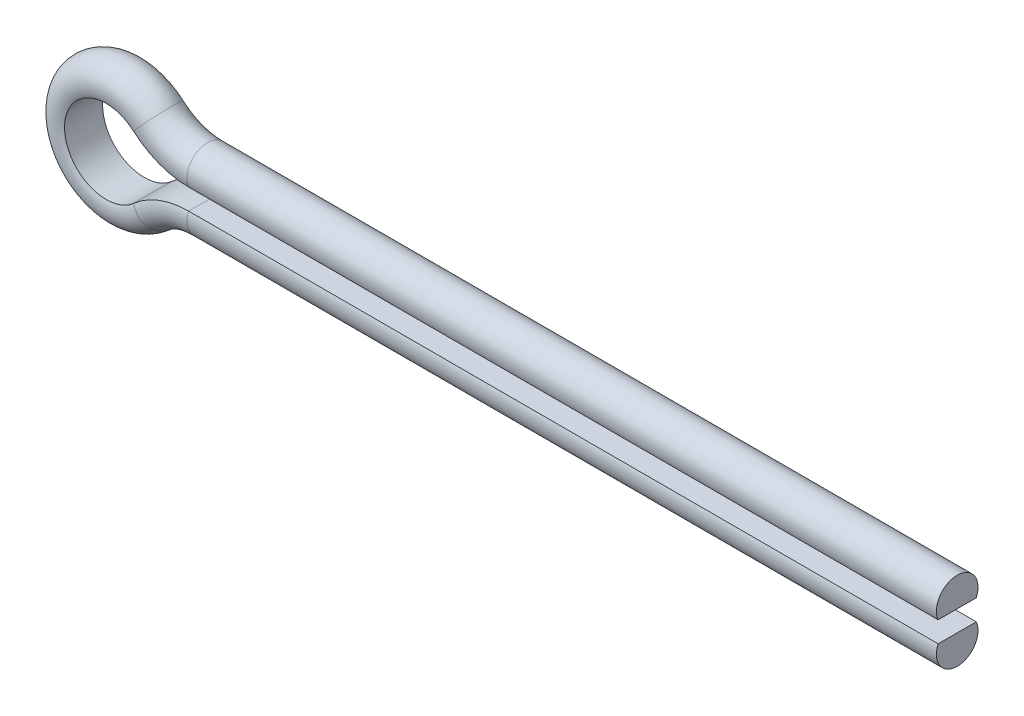
ISO-10303-21;
HEADER;
FILE_DESCRIPTION(('STEP AP214'),'2;1');
FILE_NAME('part.step','',(''),(''),'','','');
FILE_SCHEMA(('AUTOMOTIVE_DESIGN { 1 0 10303 214 1 1 1 1 }'));
ENDSEC;
DATA;
#1=APPLICATION_CONTEXT('core data for automotive mechanical design processes');
#2=APPLICATION_PROTOCOL_DEFINITION('international standard','automotive_design',2000,#1);
#3=PRODUCT_CONTEXT('',#1,'mechanical');
#4=PRODUCT('Part','Part','',(#3));
#5=PRODUCT_RELATED_PRODUCT_CATEGORY('part','',(#4));
#6=PRODUCT_DEFINITION_FORMATION('','',#4);
#7=PRODUCT_DEFINITION_CONTEXT('part definition',#1,'design');
#8=PRODUCT_DEFINITION('design','',#6,#7);
#9=PRODUCT_DEFINITION_SHAPE('','',#8);
#10=(LENGTH_UNIT() NAMED_UNIT(*) SI_UNIT(.MILLI.,.METRE.));
#11=(NAMED_UNIT(*) PLANE_ANGLE_UNIT() SI_UNIT($,.RADIAN.));
#12=(NAMED_UNIT(*) SI_UNIT($,.STERADIAN.) SOLID_ANGLE_UNIT());
#13=UNCERTAINTY_MEASURE_WITH_UNIT(LENGTH_MEASURE(1.E-05),#10,'distance_accuracy_value','');
#14=(GEOMETRIC_REPRESENTATION_CONTEXT(3) GLOBAL_UNCERTAINTY_ASSIGNED_CONTEXT((#13)) GLOBAL_UNIT_ASSIGNED_CONTEXT((#10,
#11,#12)) REPRESENTATION_CONTEXT('',''));
#15=CARTESIAN_POINT('',(0.,0.,0.));
#16=DIRECTION('',(0.,0.,1.));
#17=DIRECTION('',(1.,0.,0.));
#18=AXIS2_PLACEMENT_3D('',#15,#16,#17);
#19=CARTESIAN_POINT('',(9.92156741649231,-1.24999999999998,2.29128784747792));
#20=DIRECTION('',(0.,1.,0.));
#21=DIRECTION('',(0.,0.,1.));
#22=AXIS2_PLACEMENT_3D('',#19,#20,#21);
#23=PLANE('',#22);
#24=DIRECTION('',(0.,0.,1.));
#25=VECTOR('',#24,1.);
#26=CARTESIAN_POINT('',(9.92156741649231,-1.24999999999998,2.29128784747792));
#27=LINE('',#26,#25);
#28=CARTESIAN_POINT('',(9.92156741649231,-1.24999999999998,-2.29128784747792));
#29=VERTEX_POINT('',#28);
#30=CARTESIAN_POINT('',(9.92156741649231,-1.24999999999998,2.29128784747792));
#31=VERTEX_POINT('',#30);
#32=EDGE_CURVE('E139',#29,#31,#27,.T.);
#33=ORIENTED_EDGE('',*,*,#32,.T.);
#34=DIRECTION('',(1.,0.,0.));
#35=VECTOR('',#34,1.);
#36=CARTESIAN_POINT('',(9.92156741649231,-1.24999999999998,2.29128784747792));
#37=LINE('',#36,#35);
#38=CARTESIAN_POINT('',(100.,-1.24999999999999,2.29128784747792));
#39=VERTEX_POINT('',#38);
#40=EDGE_CURVE('E39',#31,#39,#37,.T.);
#41=ORIENTED_EDGE('',*,*,#40,.T.);
#42=DIRECTION('',(0.,0.,1.));
#43=VECTOR('',#42,1.);
#44=CARTESIAN_POINT('',(100.,-1.24999999999999,2.29128784747792));
#45=LINE('',#44,#43);
#46=CARTESIAN_POINT('',(100.,-1.24999999999999,-2.29128784747792));
#47=VERTEX_POINT('',#46);
#48=EDGE_CURVE('E46',#47,#39,#45,.T.);
#49=ORIENTED_EDGE('',*,*,#48,.F.);
#50=DIRECTION('',(1.,0.,0.));
#51=VECTOR('',#50,1.);
#52=CARTESIAN_POINT('',(9.92156741649231,-1.24999999999998,-2.29128784747792));
#53=LINE('',#52,#51);
#54=EDGE_CURVE('E11',#29,#47,#53,.T.);
#55=ORIENTED_EDGE('',*,*,#54,.F.);
#56=EDGE_LOOP('',(#33,#41,#49,#55));
#57=FACE_BOUND('',#56,.T.);
#58=ADVANCED_FACE('F32',(#57),#23,.T.);
#59=CARTESIAN_POINT('',(9.92156741649232,-2.24999999999998,0.));
#60=DIRECTION('',(1.,0.,0.));
#61=DIRECTION('',(0.,1.,0.));
#62=AXIS2_PLACEMENT_3D('',#59,#60,#61);
#63=CYLINDRICAL_SURFACE('',#62,2.5);
#64=CARTESIAN_POINT('',(9.92156741649232,-2.24999999999998,0.));
#65=DIRECTION('',(1.,0.,0.));
#66=DIRECTION('',(0.,1.,0.));
#67=AXIS2_PLACEMENT_3D('',#64,#65,#66);
#68=CIRCLE('',#67,2.5);
#69=EDGE_CURVE('E136',#31,#29,#68,.T.);
#70=ORIENTED_EDGE('',*,*,#69,.T.);
#71=ORIENTED_EDGE('',*,*,#54,.T.);
#72=CARTESIAN_POINT('',(100.,-2.24999999999999,0.));
#73=DIRECTION('',(1.,0.,0.));
#74=DIRECTION('',(0.,1.,0.));
#75=AXIS2_PLACEMENT_3D('',#72,#73,#74);
#76=CIRCLE('',#75,2.5);
#77=EDGE_CURVE('E52',#39,#47,#76,.T.);
#78=ORIENTED_EDGE('',*,*,#77,.F.);
#79=ORIENTED_EDGE('',*,*,#40,.F.);
#80=EDGE_LOOP('',(#70,#71,#78,#79));
#81=FACE_BOUND('',#80,.T.);
#82=ADVANCED_FACE('F151',(#81),#63,.T.);
#83=CARTESIAN_POINT('',(9.92156741649223,-11.25,0.));
#84=DIRECTION('',(0.,0.,-1.));
#85=DIRECTION('',(-1.,0.,0.));
#86=AXIS2_PLACEMENT_3D('',#83,#84,#85);
#87=CYLINDRICAL_SURFACE('',#86,10.);
#88=DIRECTION('',(0.,0.,1.));
#89=VECTOR('',#88,1.);
#90=CARTESIAN_POINT('',(3.30718913883079,-3.74999999999995,2.29128784747792));
#91=LINE('',#90,#89);
#92=CARTESIAN_POINT('',(3.30718913883079,-3.74999999999995,-2.29128784747792));
#93=VERTEX_POINT('',#92);
#94=CARTESIAN_POINT('',(3.30718913883079,-3.74999999999995,2.29128784747792));
#95=VERTEX_POINT('',#94);
#96=EDGE_CURVE('E127',#93,#95,#91,.T.);
#97=ORIENTED_EDGE('',*,*,#96,.T.);
#98=CARTESIAN_POINT('',(9.92156741649223,-11.25,2.29128784747792));
#99=DIRECTION('',(0.,0.,-1.));
#100=DIRECTION('',(-1.,0.,0.));
#101=AXIS2_PLACEMENT_3D('',#98,#99,#100);
#102=CIRCLE('',#101,10.);
#103=EDGE_CURVE('E142',#95,#31,#102,.T.);
#104=ORIENTED_EDGE('',*,*,#103,.T.);
#105=ORIENTED_EDGE('',*,*,#32,.F.);
#106=CARTESIAN_POINT('',(9.92156741649223,-11.25,-2.29128784747792));
#107=DIRECTION('',(0.,0.,-1.));
#108=DIRECTION('',(-1.,0.,0.));
#109=AXIS2_PLACEMENT_3D('',#106,#107,#108);
#110=CIRCLE('',#109,10.);
#111=EDGE_CURVE('E145',#93,#29,#110,.T.);
#112=ORIENTED_EDGE('',*,*,#111,.F.);
#113=EDGE_LOOP('',(#97,#104,#105,#112));
#114=FACE_BOUND('',#113,.T.);
#115=ADVANCED_FACE('F154',(#114),#87,.T.);
#116=CARTESIAN_POINT('',(9.92156741649223,-11.25,0.));
#117=DIRECTION('',(0.,0.,-1.));
#118=DIRECTION('',(-1.,0.,0.));
#119=AXIS2_PLACEMENT_3D('',#116,#117,#118);
#120=TOROIDAL_SURFACE('',#119,9.00000000000001,2.5);
#121=CARTESIAN_POINT('',(3.96862696659695,-4.49999999999993,0.));
#122=DIRECTION('',(0.749999999999988,0.661437827766161,0.));
#123=DIRECTION('',(-0.661437827766161,0.749999999999988,0.));
#124=AXIS2_PLACEMENT_3D('',#121,#122,#123);
#125=CIRCLE('',#124,2.5);
#126=EDGE_CURVE('E95',#95,#93,#125,.T.);
#127=ORIENTED_EDGE('',*,*,#126,.T.);
#128=ORIENTED_EDGE('',*,*,#111,.T.);
#129=ORIENTED_EDGE('',*,*,#69,.F.);
#130=ORIENTED_EDGE('',*,*,#103,.F.);
#131=EDGE_LOOP('',(#127,#128,#129,#130));
#132=FACE_BOUND('',#131,.T.);
#133=ADVANCED_FACE('F155',(#132),#120,.T.);
#134=CARTESIAN_POINT('',(0.,0.,0.));
#135=DIRECTION('',(0.,0.,1.));
#136=DIRECTION('',(1.,0.,0.));
#137=AXIS2_PLACEMENT_3D('',#134,#135,#136);
#138=CYLINDRICAL_SURFACE('',#137,5.);
#139=DIRECTION('',(0.,0.,1.));
#140=VECTOR('',#139,1.);
#141=CARTESIAN_POINT('',(3.30718913883075,3.75,2.29128784747792));
#142=LINE('',#141,#140);
#143=CARTESIAN_POINT('',(3.30718913883075,3.74999999999999,-2.29128784747792));
#144=VERTEX_POINT('',#143);
#145=CARTESIAN_POINT('',(3.30718913883075,3.75,2.29128784747792));
#146=VERTEX_POINT('',#145);
#147=EDGE_CURVE('E92',#144,#146,#142,.T.);
#148=ORIENTED_EDGE('',*,*,#147,.T.);
#149=CARTESIAN_POINT('',(0.,0.,2.29128784747792));
#150=DIRECTION('',(0.,0.,1.));
#151=DIRECTION('',(1.,0.,0.));
#152=AXIS2_PLACEMENT_3D('',#149,#150,#151);
#153=CIRCLE('',#152,5.);
#154=EDGE_CURVE('E130',#146,#95,#153,.T.);
#155=ORIENTED_EDGE('',*,*,#154,.T.);
#156=ORIENTED_EDGE('',*,*,#96,.F.);
#157=CARTESIAN_POINT('',(0.,0.,-2.29128784747792));
#158=DIRECTION('',(0.,0.,1.));
#159=DIRECTION('',(1.,0.,0.));
#160=AXIS2_PLACEMENT_3D('',#157,#158,#159);
#161=CIRCLE('',#160,5.);
#162=EDGE_CURVE('E133',#144,#93,#161,.T.);
#163=ORIENTED_EDGE('',*,*,#162,.F.);
#164=EDGE_LOOP('',(#148,#155,#156,#163));
#165=FACE_BOUND('',#164,.T.);
#166=ADVANCED_FACE('F160',(#165),#138,.F.);
#167=CARTESIAN_POINT('',(0.,0.,0.));
#168=DIRECTION('',(0.,0.,1.));
#169=DIRECTION('',(1.,0.,0.));
#170=AXIS2_PLACEMENT_3D('',#167,#168,#169);
#171=TOROIDAL_SURFACE('',#170,6.,2.5);
#172=CARTESIAN_POINT('',(3.9686269665969,4.49999999999999,0.));
#173=DIRECTION('',(-0.749999999999999,0.661437827766149,0.));
#174=DIRECTION('',(-0.661437827766149,-0.749999999999999,0.));
#175=AXIS2_PLACEMENT_3D('',#172,#173,#174);
#176=CIRCLE('',#175,2.5);
#177=EDGE_CURVE('E116',#146,#144,#176,.T.);
#178=ORIENTED_EDGE('',*,*,#177,.T.);
#179=ORIENTED_EDGE('',*,*,#162,.T.);
#180=ORIENTED_EDGE('',*,*,#126,.F.);
#181=ORIENTED_EDGE('',*,*,#154,.F.);
#182=EDGE_LOOP('',(#178,#179,#180,#181));
#183=FACE_BOUND('',#182,.T.);
#184=ADVANCED_FACE('F161',(#183),#171,.T.);
#185=CARTESIAN_POINT('',(9.92156741649223,11.25,0.));
#186=DIRECTION('',(0.,0.,-1.));
#187=DIRECTION('',(-1.,0.,0.));
#188=AXIS2_PLACEMENT_3D('',#185,#186,#187);
#189=CYLINDRICAL_SURFACE('',#188,10.);
#190=DIRECTION('',(0.,0.,1.));
#191=VECTOR('',#190,1.);
#192=CARTESIAN_POINT('',(9.92156741649224,1.24999999999999,2.29128784747792));
#193=LINE('',#192,#191);
#194=CARTESIAN_POINT('',(9.92156741649224,1.24999999999999,-2.29128784747792));
#195=VERTEX_POINT('',#194);
#196=CARTESIAN_POINT('',(9.92156741649224,1.24999999999999,2.29128784747792));
#197=VERTEX_POINT('',#196);
#198=EDGE_CURVE('E89',#195,#197,#193,.T.);
#199=ORIENTED_EDGE('',*,*,#198,.T.);
#200=CARTESIAN_POINT('',(9.92156741649223,11.25,2.29128784747792));
#201=DIRECTION('',(0.,0.,-1.));
#202=DIRECTION('',(-1.,0.,0.));
#203=AXIS2_PLACEMENT_3D('',#200,#201,#202);
#204=CIRCLE('',#203,10.);
#205=EDGE_CURVE('E96',#197,#146,#204,.T.);
#206=ORIENTED_EDGE('',*,*,#205,.T.);
#207=ORIENTED_EDGE('',*,*,#147,.F.);
#208=CARTESIAN_POINT('',(9.92156741649223,11.25,-2.29128784747792));
#209=DIRECTION('',(0.,0.,-1.));
#210=DIRECTION('',(-1.,0.,0.));
#211=AXIS2_PLACEMENT_3D('',#208,#209,#210);
#212=CIRCLE('',#211,10.);
#213=EDGE_CURVE('E84',#195,#144,#212,.T.);
#214=ORIENTED_EDGE('',*,*,#213,.F.);
#215=EDGE_LOOP('',(#199,#206,#207,#214));
#216=FACE_BOUND('',#215,.T.);
#217=ADVANCED_FACE('F86',(#216),#189,.T.);
#218=CARTESIAN_POINT('',(9.92156741649223,11.25,0.));
#219=DIRECTION('',(0.,0.,-1.));
#220=DIRECTION('',(-1.,0.,0.));
#221=AXIS2_PLACEMENT_3D('',#218,#219,#220);
#222=TOROIDAL_SURFACE('',#221,9.,2.5);
#223=CARTESIAN_POINT('',(9.92156741649224,2.24999999999999,0.));
#224=DIRECTION('',(-1.,0.,0.));
#225=DIRECTION('',(0.,-1.,0.));
#226=AXIS2_PLACEMENT_3D('',#223,#224,#225);
#227=CIRCLE('',#226,2.5);
#228=EDGE_CURVE('E99',#197,#195,#227,.T.);
#229=ORIENTED_EDGE('',*,*,#228,.T.);
#230=ORIENTED_EDGE('',*,*,#213,.T.);
#231=ORIENTED_EDGE('',*,*,#177,.F.);
#232=ORIENTED_EDGE('',*,*,#205,.F.);
#233=EDGE_LOOP('',(#229,#230,#231,#232));
#234=FACE_BOUND('',#233,.T.);
#235=ADVANCED_FACE('F100',(#234),#222,.T.);
#236=CARTESIAN_POINT('',(9.92156741649224,2.24999999999999,0.));
#237=DIRECTION('',(1.,0.,0.));
#238=DIRECTION('',(0.,1.,0.));
#239=AXIS2_PLACEMENT_3D('',#236,#237,#238);
#240=CYLINDRICAL_SURFACE('',#239,2.5);
#241=CARTESIAN_POINT('',(100.,2.25,0.));
#242=DIRECTION('',(-1.,0.,0.));
#243=DIRECTION('',(0.,-1.,0.));
#244=AXIS2_PLACEMENT_3D('',#241,#242,#243);
#245=CIRCLE('',#244,2.5);
#246=CARTESIAN_POINT('',(100.,1.25,2.29128784747792));
#247=VERTEX_POINT('',#246);
#248=CARTESIAN_POINT('',(100.,1.25,-2.29128784747792));
#249=VERTEX_POINT('',#248);
#250=EDGE_CURVE('E115',#247,#249,#245,.T.);
#251=ORIENTED_EDGE('',*,*,#250,.T.);
#252=DIRECTION('',(1.,0.,0.));
#253=VECTOR('',#252,1.);
#254=CARTESIAN_POINT('',(9.92156741649224,1.24999999999999,-2.29128784747792));
#255=LINE('',#254,#253);
#256=EDGE_CURVE('E109',#195,#249,#255,.T.);
#257=ORIENTED_EDGE('',*,*,#256,.F.);
#258=ORIENTED_EDGE('',*,*,#228,.F.);
#259=DIRECTION('',(1.,0.,0.));
#260=VECTOR('',#259,1.);
#261=CARTESIAN_POINT('',(9.92156741649224,1.24999999999999,2.29128784747792));
#262=LINE('',#261,#260);
#263=EDGE_CURVE('E111',#197,#247,#262,.T.);
#264=ORIENTED_EDGE('',*,*,#263,.T.);
#265=EDGE_LOOP('',(#251,#257,#258,#264));
#266=FACE_BOUND('',#265,.T.);
#267=ADVANCED_FACE('F113',(#266),#240,.T.);
#268=CARTESIAN_POINT('',(9.92156741649224,1.24999999999999,2.29128784747792));
#269=DIRECTION('',(0.,1.,0.));
#270=DIRECTION('',(0.,0.,1.));
#271=AXIS2_PLACEMENT_3D('',#268,#269,#270);
#272=PLANE('',#271);
#273=DIRECTION('',(0.,0.,1.));
#274=VECTOR('',#273,1.);
#275=CARTESIAN_POINT('',(100.,1.25,2.29128784747792));
#276=LINE('',#275,#274);
#277=EDGE_CURVE('E104',#249,#247,#276,.T.);
#278=ORIENTED_EDGE('',*,*,#277,.T.);
#279=ORIENTED_EDGE('',*,*,#263,.F.);
#280=ORIENTED_EDGE('',*,*,#198,.F.);
#281=ORIENTED_EDGE('',*,*,#256,.T.);
#282=EDGE_LOOP('',(#278,#279,#280,#281));
#283=FACE_BOUND('',#282,.T.);
#284=ADVANCED_FACE('F108',(#283),#272,.F.);
#285=CARTESIAN_POINT('',(100.,-2.24999999999999,0.));
#286=DIRECTION('',(1.,0.,0.));
#287=DIRECTION('',(0.,1.,0.));
#288=AXIS2_PLACEMENT_3D('',#285,#286,#287);
#289=PLANE('',#288);
#290=ORIENTED_EDGE('',*,*,#77,.T.);
#291=ORIENTED_EDGE('',*,*,#48,.T.);
#292=EDGE_LOOP('',(#290,#291));
#293=FACE_BOUND('',#292,.T.);
#294=ADVANCED_FACE('F223',(#293),#289,.T.);
#295=CARTESIAN_POINT('',(100.,2.25,0.));
#296=DIRECTION('',(-1.,0.,0.));
#297=DIRECTION('',(0.,-1.,0.));
#298=AXIS2_PLACEMENT_3D('',#295,#296,#297);
#299=PLANE('',#298);
#300=ORIENTED_EDGE('',*,*,#250,.F.);
#301=ORIENTED_EDGE('',*,*,#277,.F.);
#302=EDGE_LOOP('',(#300,#301));
#303=FACE_BOUND('',#302,.T.);
#304=ADVANCED_FACE('F232',(#303),#299,.F.);
#305=CLOSED_SHELL('',(#58,#82,#115,#133,#166,#184,#217,#235,#267,#284,#294,#304));
#306=MANIFOLD_SOLID_BREP('B2',#305);
#307=ADVANCED_BREP_SHAPE_REPRESENTATION('',(#18,#306),#14);
#308=SHAPE_DEFINITION_REPRESENTATION(#9,#307);
ENDSEC;
END-ISO-10303-21;
